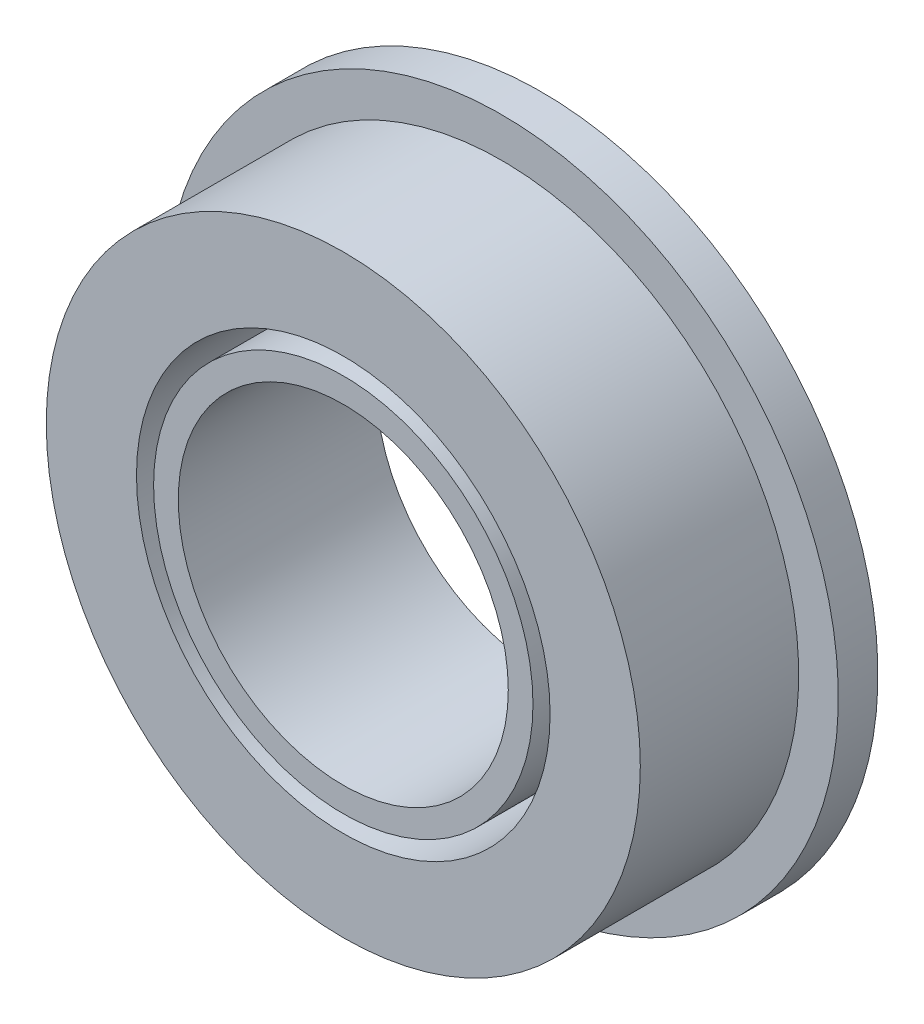
ISO-10303-21;
HEADER;
FILE_DESCRIPTION(('STEP AP214'),'2;1');
FILE_NAME('part.step','',(''),(''),'','','');
FILE_SCHEMA(('AUTOMOTIVE_DESIGN { 1 0 10303 214 1 1 1 1 }'));
ENDSEC;
DATA;
#1=APPLICATION_CONTEXT('core data for automotive mechanical design processes');
#2=APPLICATION_PROTOCOL_DEFINITION('international standard','automotive_design',2000,#1);
#3=PRODUCT_CONTEXT('',#1,'mechanical');
#4=PRODUCT('Part','Part','',(#3));
#5=PRODUCT_RELATED_PRODUCT_CATEGORY('part','',(#4));
#6=PRODUCT_DEFINITION_FORMATION('','',#4);
#7=PRODUCT_DEFINITION_CONTEXT('part definition',#1,'design');
#8=PRODUCT_DEFINITION('design','',#6,#7);
#9=PRODUCT_DEFINITION_SHAPE('','',#8);
#10=(LENGTH_UNIT() NAMED_UNIT(*) SI_UNIT(.MILLI.,.METRE.));
#11=(NAMED_UNIT(*) PLANE_ANGLE_UNIT() SI_UNIT($,.RADIAN.));
#12=(NAMED_UNIT(*) SI_UNIT($,.STERADIAN.) SOLID_ANGLE_UNIT());
#13=UNCERTAINTY_MEASURE_WITH_UNIT(LENGTH_MEASURE(1.E-05),#10,'distance_accuracy_value','');
#14=(GEOMETRIC_REPRESENTATION_CONTEXT(3) GLOBAL_UNCERTAINTY_ASSIGNED_CONTEXT((#13)) GLOBAL_UNIT_ASSIGNED_CONTEXT((#10,
#11,#12)) REPRESENTATION_CONTEXT('',''));
#15=CARTESIAN_POINT('',(0.,0.,0.));
#16=DIRECTION('',(0.,0.,1.));
#17=DIRECTION('',(1.,0.,0.));
#18=AXIS2_PLACEMENT_3D('',#15,#16,#17);
#19=CARTESIAN_POINT('',(0.,0.,3.));
#20=DIRECTION('',(0.,0.,-1.));
#21=DIRECTION('',(-1.,0.,0.));
#22=AXIS2_PLACEMENT_3D('',#19,#20,#21);
#23=CYLINDRICAL_SURFACE('',#22,4.5);
#24=CARTESIAN_POINT('',(0.,0.,3.));
#25=DIRECTION('',(0.,0.,1.));
#26=DIRECTION('',(1.,0.,0.));
#27=AXIS2_PLACEMENT_3D('',#24,#25,#26);
#28=CIRCLE('',#27,4.5);
#29=CARTESIAN_POINT('',(4.5,0.,3.));
#30=VERTEX_POINT('',#29);
#31=EDGE_CURVE('E70',#30,#30,#28,.T.);
#32=ORIENTED_EDGE('',*,*,#31,.F.);
#33=EDGE_LOOP('',(#32));
#34=FACE_BOUND('',#33,.T.);
#35=CARTESIAN_POINT('',(0.,0.,0.6));
#36=DIRECTION('',(0.,0.,-1.));
#37=DIRECTION('',(-1.,0.,0.));
#38=AXIS2_PLACEMENT_3D('',#35,#36,#37);
#39=CIRCLE('',#38,4.5);
#40=CARTESIAN_POINT('',(-4.5,0.,0.6));
#41=VERTEX_POINT('',#40);
#42=EDGE_CURVE('E63',#41,#41,#39,.T.);
#43=ORIENTED_EDGE('',*,*,#42,.F.);
#44=EDGE_LOOP('',(#43));
#45=FACE_BOUND('',#44,.T.);
#46=ADVANCED_FACE('F45',(#34,#45),#23,.T.);
#47=CARTESIAN_POINT('',(0.,0.,3.));
#48=DIRECTION('',(0.,0.,1.));
#49=DIRECTION('',(1.,0.,0.));
#50=AXIS2_PLACEMENT_3D('',#47,#48,#49);
#51=PLANE('',#50);
#52=CARTESIAN_POINT('',(0.,0.,3.));
#53=DIRECTION('',(0.,0.,1.));
#54=DIRECTION('',(1.,0.,0.));
#55=AXIS2_PLACEMENT_3D('',#52,#53,#54);
#56=CIRCLE('',#55,3.13316109528732);
#57=CARTESIAN_POINT('',(3.13316109528732,0.,3.));
#58=VERTEX_POINT('',#57);
#59=EDGE_CURVE('E53',#58,#58,#56,.T.);
#60=ORIENTED_EDGE('',*,*,#59,.F.);
#61=EDGE_LOOP('',(#60));
#62=FACE_BOUND('',#61,.T.);
#63=ORIENTED_EDGE('',*,*,#31,.T.);
#64=EDGE_LOOP('',(#63));
#65=FACE_BOUND('',#64,.T.);
#66=ADVANCED_FACE('F78',(#62,#65),#51,.T.);
#67=CARTESIAN_POINT('',(0.,0.,0.));
#68=DIRECTION('',(0.,0.,1.));
#69=DIRECTION('',(1.,0.,0.));
#70=AXIS2_PLACEMENT_3D('',#67,#68,#69);
#71=PLANE('',#70);
#72=CARTESIAN_POINT('',(0.,0.,0.));
#73=DIRECTION('',(0.,0.,-1.));
#74=DIRECTION('',(-1.,0.,0.));
#75=AXIS2_PLACEMENT_3D('',#72,#73,#74);
#76=CIRCLE('',#75,3.13316109528732);
#77=CARTESIAN_POINT('',(-3.13316109528732,0.,0.));
#78=VERTEX_POINT('',#77);
#79=EDGE_CURVE('E11',#78,#78,#76,.T.);
#80=ORIENTED_EDGE('',*,*,#79,.F.);
#81=EDGE_LOOP('',(#80));
#82=FACE_BOUND('',#81,.T.);
#83=CARTESIAN_POINT('',(0.,0.,0.));
#84=DIRECTION('',(0.,0.,-1.));
#85=DIRECTION('',(-1.,0.,0.));
#86=AXIS2_PLACEMENT_3D('',#83,#84,#85);
#87=CIRCLE('',#86,5.1);
#88=CARTESIAN_POINT('',(-5.1,0.,0.));
#89=VERTEX_POINT('',#88);
#90=EDGE_CURVE('E66',#89,#89,#87,.T.);
#91=ORIENTED_EDGE('',*,*,#90,.T.);
#92=EDGE_LOOP('',(#91));
#93=FACE_BOUND('',#92,.T.);
#94=ADVANCED_FACE('F47',(#82,#93),#71,.F.);
#95=CARTESIAN_POINT('',(0.,0.,0.6));
#96=DIRECTION('',(0.,0.,-1.));
#97=DIRECTION('',(-1.,0.,0.));
#98=AXIS2_PLACEMENT_3D('',#95,#96,#97);
#99=PLANE('',#98);
#100=CARTESIAN_POINT('',(0.,0.,0.6));
#101=DIRECTION('',(0.,0.,-1.));
#102=DIRECTION('',(-1.,0.,0.));
#103=AXIS2_PLACEMENT_3D('',#100,#101,#102);
#104=CIRCLE('',#103,5.1);
#105=CARTESIAN_POINT('',(-5.1,0.,0.6));
#106=VERTEX_POINT('',#105);
#107=EDGE_CURVE('E58',#106,#106,#104,.T.);
#108=ORIENTED_EDGE('',*,*,#107,.F.);
#109=EDGE_LOOP('',(#108));
#110=FACE_BOUND('',#109,.T.);
#111=ORIENTED_EDGE('',*,*,#42,.T.);
#112=EDGE_LOOP('',(#111));
#113=FACE_BOUND('',#112,.T.);
#114=ADVANCED_FACE('F85',(#110,#113),#99,.F.);
#115=CARTESIAN_POINT('',(0.,0.,0.6));
#116=DIRECTION('',(0.,0.,-1.));
#117=DIRECTION('',(-1.,0.,0.));
#118=AXIS2_PLACEMENT_3D('',#115,#116,#117);
#119=CYLINDRICAL_SURFACE('',#118,5.1);
#120=ORIENTED_EDGE('',*,*,#107,.T.);
#121=EDGE_LOOP('',(#120));
#122=FACE_BOUND('',#121,.T.);
#123=ORIENTED_EDGE('',*,*,#90,.F.);
#124=EDGE_LOOP('',(#123));
#125=FACE_BOUND('',#124,.T.);
#126=ADVANCED_FACE('F87',(#122,#125),#119,.T.);
#127=CARTESIAN_POINT('',(0.,0.,6.6));
#128=DIRECTION('',(0.,0.,-1.));
#129=DIRECTION('',(-1.,0.,0.));
#130=AXIS2_PLACEMENT_3D('',#127,#128,#129);
#131=CYLINDRICAL_SURFACE('',#130,3.13316109528732);
#132=ORIENTED_EDGE('',*,*,#59,.T.);
#133=EDGE_LOOP('',(#132));
#134=FACE_BOUND('',#133,.T.);
#135=ORIENTED_EDGE('',*,*,#79,.T.);
#136=EDGE_LOOP('',(#135));
#137=FACE_BOUND('',#136,.T.);
#138=ADVANCED_FACE('F94',(#134,#137),#131,.F.);
#139=CLOSED_SHELL('',(#46,#66,#94,#114,#126,#138));
#140=MANIFOLD_SOLID_BREP('B2',#139);
#141=CARTESIAN_POINT('',(0.,0.,3.));
#142=DIRECTION('',(0.,0.,1.));
#143=DIRECTION('',(1.,0.,0.));
#144=AXIS2_PLACEMENT_3D('',#141,#142,#143);
#145=PLANE('',#144);
#146=CARTESIAN_POINT('',(0.,0.,3.));
#147=DIRECTION('',(0.,0.,1.));
#148=DIRECTION('',(1.,0.,0.));
#149=AXIS2_PLACEMENT_3D('',#146,#147,#148);
#150=CIRCLE('',#149,2.5);
#151=CARTESIAN_POINT('',(2.5,0.,3.));
#152=VERTEX_POINT('',#151);
#153=EDGE_CURVE('E44',#152,#152,#150,.T.);
#154=ORIENTED_EDGE('',*,*,#153,.F.);
#155=EDGE_LOOP('',(#154));
#156=FACE_BOUND('',#155,.T.);
#157=CARTESIAN_POINT('',(0.,0.,3.));
#158=DIRECTION('',(0.,0.,1.));
#159=DIRECTION('',(1.,0.,0.));
#160=AXIS2_PLACEMENT_3D('',#157,#158,#159);
#161=CIRCLE('',#160,2.87395189599086);
#162=CARTESIAN_POINT('',(2.87395189599086,0.,3.));
#163=VERTEX_POINT('',#162);
#164=EDGE_CURVE('E157',#163,#163,#161,.T.);
#165=ORIENTED_EDGE('',*,*,#164,.T.);
#166=EDGE_LOOP('',(#165));
#167=FACE_BOUND('',#166,.T.);
#168=ADVANCED_FACE('F146',(#156,#167),#145,.T.);
#169=CARTESIAN_POINT('',(0.,0.,3.));
#170=DIRECTION('',(0.,0.,-1.));
#171=DIRECTION('',(-1.,0.,0.));
#172=AXIS2_PLACEMENT_3D('',#169,#170,#171);
#173=CYLINDRICAL_SURFACE('',#172,2.5);
#174=CARTESIAN_POINT('',(0.,0.,0.));
#175=DIRECTION('',(0.,0.,1.));
#176=DIRECTION('',(1.,0.,0.));
#177=AXIS2_PLACEMENT_3D('',#174,#175,#176);
#178=CIRCLE('',#177,2.5);
#179=CARTESIAN_POINT('',(2.5,0.,0.));
#180=VERTEX_POINT('',#179);
#181=EDGE_CURVE('E150',#180,#180,#178,.T.);
#182=ORIENTED_EDGE('',*,*,#181,.F.);
#183=EDGE_LOOP('',(#182));
#184=FACE_BOUND('',#183,.T.);
#185=ORIENTED_EDGE('',*,*,#153,.T.);
#186=EDGE_LOOP('',(#185));
#187=FACE_BOUND('',#186,.T.);
#188=ADVANCED_FACE('F173',(#184,#187),#173,.F.);
#189=CARTESIAN_POINT('',(0.,0.,0.));
#190=DIRECTION('',(0.,0.,1.));
#191=DIRECTION('',(1.,0.,0.));
#192=AXIS2_PLACEMENT_3D('',#189,#190,#191);
#193=PLANE('',#192);
#194=ORIENTED_EDGE('',*,*,#181,.T.);
#195=EDGE_LOOP('',(#194));
#196=FACE_BOUND('',#195,.T.);
#197=CARTESIAN_POINT('',(0.,0.,0.));
#198=DIRECTION('',(0.,0.,-1.));
#199=DIRECTION('',(-1.,0.,0.));
#200=AXIS2_PLACEMENT_3D('',#197,#198,#199);
#201=CIRCLE('',#200,2.87395189599086);
#202=CARTESIAN_POINT('',(-2.87395189599086,0.,0.));
#203=VERTEX_POINT('',#202);
#204=EDGE_CURVE('E161',#203,#203,#201,.T.);
#205=ORIENTED_EDGE('',*,*,#204,.T.);
#206=EDGE_LOOP('',(#205));
#207=FACE_BOUND('',#206,.T.);
#208=ADVANCED_FACE('F148',(#196,#207),#193,.F.);
#209=CARTESIAN_POINT('',(0.,0.,6.6));
#210=DIRECTION('',(0.,0.,-1.));
#211=DIRECTION('',(-1.,0.,0.));
#212=AXIS2_PLACEMENT_3D('',#209,#210,#211);
#213=CYLINDRICAL_SURFACE('',#212,2.87395189599086);
#214=ORIENTED_EDGE('',*,*,#164,.F.);
#215=EDGE_LOOP('',(#214));
#216=FACE_BOUND('',#215,.T.);
#217=ORIENTED_EDGE('',*,*,#204,.F.);
#218=EDGE_LOOP('',(#217));
#219=FACE_BOUND('',#218,.T.);
#220=ADVANCED_FACE('F166',(#216,#219),#213,.T.);
#221=CLOSED_SHELL('',(#168,#188,#208,#220));
#222=MANIFOLD_SOLID_BREP('B6',#221);
#223=ADVANCED_BREP_SHAPE_REPRESENTATION('',(#18,#140,#222),#14);
#224=SHAPE_DEFINITION_REPRESENTATION(#9,#223);
ENDSEC;
END-ISO-10303-21;
